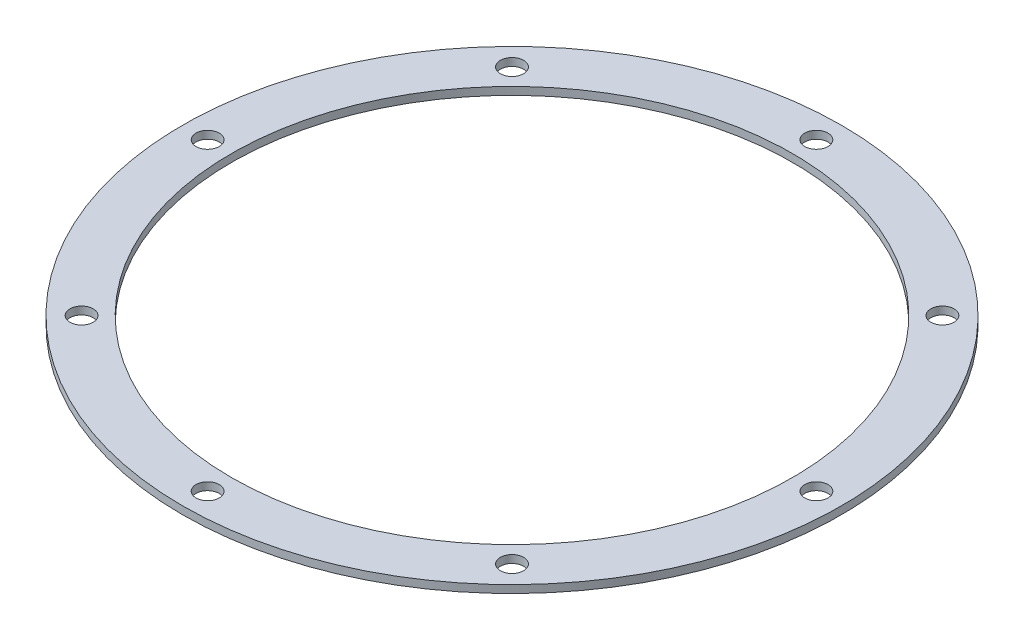
ISO-10303-21;
HEADER;
FILE_DESCRIPTION(('STEP AP214'),'2;1');
FILE_NAME('part.step','',(''),(''),'','','');
FILE_SCHEMA(('AUTOMOTIVE_DESIGN { 1 0 10303 214 1 1 1 1 }'));
ENDSEC;
DATA;
#1=APPLICATION_CONTEXT('core data for automotive mechanical design processes');
#2=APPLICATION_PROTOCOL_DEFINITION('international standard','automotive_design',2000,#1);
#3=PRODUCT_CONTEXT('',#1,'mechanical');
#4=PRODUCT('Part','Part','',(#3));
#5=PRODUCT_RELATED_PRODUCT_CATEGORY('part','',(#4));
#6=PRODUCT_DEFINITION_FORMATION('','',#4);
#7=PRODUCT_DEFINITION_CONTEXT('part definition',#1,'design');
#8=PRODUCT_DEFINITION('design','',#6,#7);
#9=PRODUCT_DEFINITION_SHAPE('','',#8);
#10=(LENGTH_UNIT() NAMED_UNIT(*) SI_UNIT(.MILLI.,.METRE.));
#11=(NAMED_UNIT(*) PLANE_ANGLE_UNIT() SI_UNIT($,.RADIAN.));
#12=(NAMED_UNIT(*) SI_UNIT($,.STERADIAN.) SOLID_ANGLE_UNIT());
#13=UNCERTAINTY_MEASURE_WITH_UNIT(LENGTH_MEASURE(1.E-05),#10,'distance_accuracy_value','');
#14=(GEOMETRIC_REPRESENTATION_CONTEXT(3) GLOBAL_UNCERTAINTY_ASSIGNED_CONTEXT((#13)) GLOBAL_UNIT_ASSIGNED_CONTEXT((#10,
#11,#12)) REPRESENTATION_CONTEXT('',''));
#15=CARTESIAN_POINT('',(0.,0.,0.));
#16=DIRECTION('',(0.,0.,1.));
#17=DIRECTION('',(1.,0.,0.));
#18=AXIS2_PLACEMENT_3D('',#15,#16,#17);
#19=CARTESIAN_POINT('',(0.,2.,0.));
#20=DIRECTION('',(0.,-1.,0.));
#21=DIRECTION('',(0.,0.,-1.));
#22=AXIS2_PLACEMENT_3D('',#19,#20,#21);
#23=CYLINDRICAL_SURFACE('',#22,85.);
#24=CARTESIAN_POINT('',(0.,2.,0.));
#25=DIRECTION('',(0.,1.,0.));
#26=DIRECTION('',(0.,0.,1.));
#27=AXIS2_PLACEMENT_3D('',#24,#25,#26);
#28=CIRCLE('',#27,85.);
#29=CARTESIAN_POINT('',(0.,2.,85.));
#30=VERTEX_POINT('',#29);
#31=EDGE_CURVE('E44',#30,#30,#28,.T.);
#32=ORIENTED_EDGE('',*,*,#31,.F.);
#33=EDGE_LOOP('',(#32));
#34=FACE_BOUND('',#33,.T.);
#35=CARTESIAN_POINT('',(0.,0.,0.));
#36=DIRECTION('',(0.,1.,0.));
#37=DIRECTION('',(0.,0.,1.));
#38=AXIS2_PLACEMENT_3D('',#35,#36,#37);
#39=CIRCLE('',#38,85.);
#40=CARTESIAN_POINT('',(0.,0.,85.));
#41=VERTEX_POINT('',#40);
#42=EDGE_CURVE('E51',#41,#41,#39,.T.);
#43=ORIENTED_EDGE('',*,*,#42,.T.);
#44=EDGE_LOOP('',(#43));
#45=FACE_BOUND('',#44,.T.);
#46=ADVANCED_FACE('F37',(#34,#45),#23,.T.);
#47=CARTESIAN_POINT('',(0.,2.,0.));
#48=DIRECTION('',(0.,-1.,0.));
#49=DIRECTION('',(0.,0.,-1.));
#50=AXIS2_PLACEMENT_3D('',#47,#48,#49);
#51=CYLINDRICAL_SURFACE('',#50,72.375);
#52=CARTESIAN_POINT('',(0.,2.,0.));
#53=DIRECTION('',(0.,1.,0.));
#54=DIRECTION('',(0.,0.,1.));
#55=AXIS2_PLACEMENT_3D('',#52,#53,#54);
#56=CIRCLE('',#55,72.375);
#57=CARTESIAN_POINT('',(0.,2.,72.375));
#58=VERTEX_POINT('',#57);
#59=EDGE_CURVE('E10',#58,#58,#56,.T.);
#60=ORIENTED_EDGE('',*,*,#59,.T.);
#61=EDGE_LOOP('',(#60));
#62=FACE_BOUND('',#61,.T.);
#63=CARTESIAN_POINT('',(0.,0.,0.));
#64=DIRECTION('',(0.,1.,0.));
#65=DIRECTION('',(0.,0.,1.));
#66=AXIS2_PLACEMENT_3D('',#63,#64,#65);
#67=CIRCLE('',#66,72.375);
#68=CARTESIAN_POINT('',(0.,0.,72.375));
#69=VERTEX_POINT('',#68);
#70=EDGE_CURVE('E40',#69,#69,#67,.T.);
#71=ORIENTED_EDGE('',*,*,#70,.F.);
#72=EDGE_LOOP('',(#71));
#73=FACE_BOUND('',#72,.T.);
#74=ADVANCED_FACE('F132',(#62,#73),#51,.F.);
#75=CARTESIAN_POINT('',(0.,2.,0.));
#76=DIRECTION('',(0.,1.,0.));
#77=DIRECTION('',(0.,0.,1.));
#78=AXIS2_PLACEMENT_3D('',#75,#76,#77);
#79=PLANE('',#78);
#80=CARTESIAN_POINT('',(0.,2.,-78.5));
#81=DIRECTION('',(0.,-1.,0.));
#82=DIRECTION('',(0.,0.,-1.));
#83=AXIS2_PLACEMENT_3D('',#80,#81,#82);
#84=CIRCLE('',#83,3.);
#85=CARTESIAN_POINT('',(0.,2.,-81.5));
#86=VERTEX_POINT('',#85);
#87=EDGE_CURVE('E100',#86,#86,#84,.T.);
#88=ORIENTED_EDGE('',*,*,#87,.T.);
#89=EDGE_LOOP('',(#88));
#90=FACE_BOUND('',#89,.T.);
#91=CARTESIAN_POINT('',(-55.5078823231459,2.,-55.5078823231487));
#92=DIRECTION('',(0.,-1.,0.));
#93=DIRECTION('',(0.,0.,-1.));
#94=AXIS2_PLACEMENT_3D('',#91,#92,#93);
#95=CIRCLE('',#94,3.);
#96=CARTESIAN_POINT('',(-55.5078823231459,2.,-58.5078823231487));
#97=VERTEX_POINT('',#96);
#98=EDGE_CURVE('E94',#97,#97,#95,.T.);
#99=ORIENTED_EDGE('',*,*,#98,.T.);
#100=EDGE_LOOP('',(#99));
#101=FACE_BOUND('',#100,.T.);
#102=CARTESIAN_POINT('',(-78.5000000000067,2.,-6.67889235480018E-12));
#103=DIRECTION('',(0.,-1.,0.));
#104=DIRECTION('',(0.,0.,-1.));
#105=AXIS2_PLACEMENT_3D('',#102,#103,#104);
#106=CIRCLE('',#105,3.);
#107=CARTESIAN_POINT('',(-78.5000000000067,2.,-3.00000000000668));
#108=VERTEX_POINT('',#107);
#109=EDGE_CURVE('E88',#108,#108,#106,.T.);
#110=ORIENTED_EDGE('',*,*,#109,.T.);
#111=EDGE_LOOP('',(#110));
#112=FACE_BOUND('',#111,.T.);
#113=CARTESIAN_POINT('',(-55.5078823231554,2.,55.5078823231393));
#114=DIRECTION('',(0.,-1.,0.));
#115=DIRECTION('',(0.,0.,-1.));
#116=AXIS2_PLACEMENT_3D('',#113,#114,#115);
#117=CIRCLE('',#116,3.);
#118=CARTESIAN_POINT('',(-55.5078823231554,2.,52.5078823231393));
#119=VERTEX_POINT('',#118);
#120=EDGE_CURVE('E82',#119,#119,#117,.T.);
#121=ORIENTED_EDGE('',*,*,#120,.T.);
#122=EDGE_LOOP('',(#121));
#123=FACE_BOUND('',#122,.T.);
#124=CARTESIAN_POINT('',(-1.33577847096004E-11,2.,78.5));
#125=DIRECTION('',(0.,-1.,0.));
#126=DIRECTION('',(0.,0.,-1.));
#127=AXIS2_PLACEMENT_3D('',#124,#125,#126);
#128=CIRCLE('',#127,3.);
#129=CARTESIAN_POINT('',(-1.33577847096004E-11,2.,75.5));
#130=VERTEX_POINT('',#129);
#131=EDGE_CURVE('E76',#130,#130,#128,.T.);
#132=ORIENTED_EDGE('',*,*,#131,.T.);
#133=EDGE_LOOP('',(#132));
#134=FACE_BOUND('',#133,.T.);
#135=CARTESIAN_POINT('',(55.5078823231326,2.,55.5078823231487));
#136=DIRECTION('',(0.,-1.,0.));
#137=DIRECTION('',(0.,0.,-1.));
#138=AXIS2_PLACEMENT_3D('',#135,#136,#137);
#139=CIRCLE('',#138,3.);
#140=CARTESIAN_POINT('',(55.5078823231326,2.,52.5078823231487));
#141=VERTEX_POINT('',#140);
#142=EDGE_CURVE('E70',#141,#141,#139,.T.);
#143=ORIENTED_EDGE('',*,*,#142,.T.);
#144=EDGE_LOOP('',(#143));
#145=FACE_BOUND('',#144,.T.);
#146=CARTESIAN_POINT('',(78.4999999999933,2.,6.68850583217349E-12));
#147=DIRECTION('',(0.,-1.,0.));
#148=DIRECTION('',(0.,0.,-1.));
#149=AXIS2_PLACEMENT_3D('',#146,#147,#148);
#150=CIRCLE('',#149,3.);
#151=CARTESIAN_POINT('',(78.4999999999933,2.,-2.99999999999331));
#152=VERTEX_POINT('',#151);
#153=EDGE_CURVE('E62',#152,#152,#150,.T.);
#154=ORIENTED_EDGE('',*,*,#153,.T.);
#155=EDGE_LOOP('',(#154));
#156=FACE_BOUND('',#155,.T.);
#157=CARTESIAN_POINT('',(55.507882323142,2.,-55.5078823231393));
#158=DIRECTION('',(0.,-1.,0.));
#159=DIRECTION('',(0.,0.,-1.));
#160=AXIS2_PLACEMENT_3D('',#157,#158,#159);
#161=CIRCLE('',#160,3.);
#162=CARTESIAN_POINT('',(55.507882323142,2.,-58.5078823231393));
#163=VERTEX_POINT('',#162);
#164=EDGE_CURVE('E53',#163,#163,#161,.T.);
#165=ORIENTED_EDGE('',*,*,#164,.T.);
#166=EDGE_LOOP('',(#165));
#167=FACE_BOUND('',#166,.T.);
#168=ORIENTED_EDGE('',*,*,#31,.T.);
#169=EDGE_LOOP('',(#168));
#170=FACE_BOUND('',#169,.T.);
#171=ORIENTED_EDGE('',*,*,#59,.F.);
#172=EDGE_LOOP('',(#171));
#173=FACE_BOUND('',#172,.T.);
#174=ADVANCED_FACE('F113',(#90,#101,#112,#123,#134,#145,#156,#167,#170,#173),#79,.T.);
#175=CARTESIAN_POINT('',(0.,0.,0.));
#176=DIRECTION('',(0.,1.,0.));
#177=DIRECTION('',(0.,0.,1.));
#178=AXIS2_PLACEMENT_3D('',#175,#176,#177);
#179=PLANE('',#178);
#180=CARTESIAN_POINT('',(0.,0.,-78.5));
#181=DIRECTION('',(0.,-1.,0.));
#182=DIRECTION('',(0.,0.,-1.));
#183=AXIS2_PLACEMENT_3D('',#180,#181,#182);
#184=CIRCLE('',#183,2.99999999999999);
#185=CARTESIAN_POINT('',(0.,0.,-81.5));
#186=VERTEX_POINT('',#185);
#187=EDGE_CURVE('E103',#186,#186,#184,.T.);
#188=ORIENTED_EDGE('',*,*,#187,.F.);
#189=EDGE_LOOP('',(#188));
#190=FACE_BOUND('',#189,.T.);
#191=CARTESIAN_POINT('',(-55.5078823231459,0.,-55.5078823231487));
#192=DIRECTION('',(0.,-1.,0.));
#193=DIRECTION('',(0.,0.,-1.));
#194=AXIS2_PLACEMENT_3D('',#191,#192,#193);
#195=CIRCLE('',#194,2.99999999999999);
#196=CARTESIAN_POINT('',(-55.5078823231459,0.,-58.5078823231487));
#197=VERTEX_POINT('',#196);
#198=EDGE_CURVE('E97',#197,#197,#195,.T.);
#199=ORIENTED_EDGE('',*,*,#198,.F.);
#200=EDGE_LOOP('',(#199));
#201=FACE_BOUND('',#200,.T.);
#202=CARTESIAN_POINT('',(-78.5000000000067,0.,-6.67889235480018E-12));
#203=DIRECTION('',(0.,-1.,0.));
#204=DIRECTION('',(0.,0.,-1.));
#205=AXIS2_PLACEMENT_3D('',#202,#203,#204);
#206=CIRCLE('',#205,2.99999999999999);
#207=CARTESIAN_POINT('',(-78.5000000000067,0.,-3.00000000000667));
#208=VERTEX_POINT('',#207);
#209=EDGE_CURVE('E91',#208,#208,#206,.T.);
#210=ORIENTED_EDGE('',*,*,#209,.F.);
#211=EDGE_LOOP('',(#210));
#212=FACE_BOUND('',#211,.T.);
#213=CARTESIAN_POINT('',(-55.5078823231554,0.,55.5078823231393));
#214=DIRECTION('',(0.,-1.,0.));
#215=DIRECTION('',(0.,0.,-1.));
#216=AXIS2_PLACEMENT_3D('',#213,#214,#215);
#217=CIRCLE('',#216,2.99999999999999);
#218=CARTESIAN_POINT('',(-55.5078823231554,0.,52.5078823231393));
#219=VERTEX_POINT('',#218);
#220=EDGE_CURVE('E85',#219,#219,#217,.T.);
#221=ORIENTED_EDGE('',*,*,#220,.F.);
#222=EDGE_LOOP('',(#221));
#223=FACE_BOUND('',#222,.T.);
#224=CARTESIAN_POINT('',(-1.33577847096004E-11,0.,78.5));
#225=DIRECTION('',(0.,-1.,0.));
#226=DIRECTION('',(0.,0.,-1.));
#227=AXIS2_PLACEMENT_3D('',#224,#225,#226);
#228=CIRCLE('',#227,2.99999999999999);
#229=CARTESIAN_POINT('',(-1.33577847096004E-11,0.,75.5));
#230=VERTEX_POINT('',#229);
#231=EDGE_CURVE('E79',#230,#230,#228,.T.);
#232=ORIENTED_EDGE('',*,*,#231,.F.);
#233=EDGE_LOOP('',(#232));
#234=FACE_BOUND('',#233,.T.);
#235=CARTESIAN_POINT('',(55.5078823231326,0.,55.5078823231487));
#236=DIRECTION('',(0.,-1.,0.));
#237=DIRECTION('',(0.,0.,-1.));
#238=AXIS2_PLACEMENT_3D('',#235,#236,#237);
#239=CIRCLE('',#238,2.99999999999999);
#240=CARTESIAN_POINT('',(55.5078823231326,0.,52.5078823231487));
#241=VERTEX_POINT('',#240);
#242=EDGE_CURVE('E73',#241,#241,#239,.T.);
#243=ORIENTED_EDGE('',*,*,#242,.F.);
#244=EDGE_LOOP('',(#243));
#245=FACE_BOUND('',#244,.T.);
#246=CARTESIAN_POINT('',(78.4999999999933,0.,6.68850583217349E-12));
#247=DIRECTION('',(0.,-1.,0.));
#248=DIRECTION('',(0.,0.,-1.));
#249=AXIS2_PLACEMENT_3D('',#246,#247,#248);
#250=CIRCLE('',#249,2.99999999999999);
#251=CARTESIAN_POINT('',(78.4999999999933,0.,-2.9999999999933));
#252=VERTEX_POINT('',#251);
#253=EDGE_CURVE('E67',#252,#252,#250,.T.);
#254=ORIENTED_EDGE('',*,*,#253,.F.);
#255=EDGE_LOOP('',(#254));
#256=FACE_BOUND('',#255,.T.);
#257=CARTESIAN_POINT('',(55.507882323142,0.,-55.5078823231393));
#258=DIRECTION('',(0.,-1.,0.));
#259=DIRECTION('',(0.,0.,-1.));
#260=AXIS2_PLACEMENT_3D('',#257,#258,#259);
#261=CIRCLE('',#260,2.99999999999999);
#262=CARTESIAN_POINT('',(55.507882323142,0.,-58.5078823231393));
#263=VERTEX_POINT('',#262);
#264=EDGE_CURVE('E58',#263,#263,#261,.T.);
#265=ORIENTED_EDGE('',*,*,#264,.F.);
#266=EDGE_LOOP('',(#265));
#267=FACE_BOUND('',#266,.T.);
#268=ORIENTED_EDGE('',*,*,#42,.F.);
#269=EDGE_LOOP('',(#268));
#270=FACE_BOUND('',#269,.T.);
#271=ORIENTED_EDGE('',*,*,#70,.T.);
#272=EDGE_LOOP('',(#271));
#273=FACE_BOUND('',#272,.T.);
#274=ADVANCED_FACE('F109',(#190,#201,#212,#223,#234,#245,#256,#267,#270,#273),#179,.F.);
#275=CARTESIAN_POINT('',(55.507882323142,0.,-55.5078823231393));
#276=DIRECTION('',(0.,-1.,0.));
#277=DIRECTION('',(0.,0.,-1.));
#278=AXIS2_PLACEMENT_3D('',#275,#276,#277);
#279=CYLINDRICAL_SURFACE('',#278,3.);
#280=ORIENTED_EDGE('',*,*,#164,.F.);
#281=EDGE_LOOP('',(#280));
#282=FACE_BOUND('',#281,.T.);
#283=ORIENTED_EDGE('',*,*,#264,.T.);
#284=EDGE_LOOP('',(#283));
#285=FACE_BOUND('',#284,.T.);
#286=ADVANCED_FACE('F112',(#282,#285),#279,.F.);
#287=CARTESIAN_POINT('',(78.4999999999933,0.,6.68850583217349E-12));
#288=DIRECTION('',(0.,-1.,0.));
#289=DIRECTION('',(0.,0.,-1.));
#290=AXIS2_PLACEMENT_3D('',#287,#288,#289);
#291=CYLINDRICAL_SURFACE('',#290,3.);
#292=ORIENTED_EDGE('',*,*,#153,.F.);
#293=EDGE_LOOP('',(#292));
#294=FACE_BOUND('',#293,.T.);
#295=ORIENTED_EDGE('',*,*,#253,.T.);
#296=EDGE_LOOP('',(#295));
#297=FACE_BOUND('',#296,.T.);
#298=ADVANCED_FACE('F144',(#294,#297),#291,.F.);
#299=CARTESIAN_POINT('',(55.5078823231326,0.,55.5078823231487));
#300=DIRECTION('',(0.,-1.,0.));
#301=DIRECTION('',(0.,0.,-1.));
#302=AXIS2_PLACEMENT_3D('',#299,#300,#301);
#303=CYLINDRICAL_SURFACE('',#302,3.);
#304=ORIENTED_EDGE('',*,*,#142,.F.);
#305=EDGE_LOOP('',(#304));
#306=FACE_BOUND('',#305,.T.);
#307=ORIENTED_EDGE('',*,*,#242,.T.);
#308=EDGE_LOOP('',(#307));
#309=FACE_BOUND('',#308,.T.);
#310=ADVANCED_FACE('F148',(#306,#309),#303,.F.);
#311=CARTESIAN_POINT('',(-1.33577847096004E-11,0.,78.5));
#312=DIRECTION('',(0.,-1.,0.));
#313=DIRECTION('',(0.,0.,-1.));
#314=AXIS2_PLACEMENT_3D('',#311,#312,#313);
#315=CYLINDRICAL_SURFACE('',#314,2.99999999999999);
#316=ORIENTED_EDGE('',*,*,#131,.F.);
#317=EDGE_LOOP('',(#316));
#318=FACE_BOUND('',#317,.T.);
#319=ORIENTED_EDGE('',*,*,#231,.T.);
#320=EDGE_LOOP('',(#319));
#321=FACE_BOUND('',#320,.T.);
#322=ADVANCED_FACE('F152',(#318,#321),#315,.F.);
#323=CARTESIAN_POINT('',(-55.5078823231554,0.,55.5078823231393));
#324=DIRECTION('',(0.,-1.,0.));
#325=DIRECTION('',(0.,0.,-1.));
#326=AXIS2_PLACEMENT_3D('',#323,#324,#325);
#327=CYLINDRICAL_SURFACE('',#326,3.);
#328=ORIENTED_EDGE('',*,*,#120,.F.);
#329=EDGE_LOOP('',(#328));
#330=FACE_BOUND('',#329,.T.);
#331=ORIENTED_EDGE('',*,*,#220,.T.);
#332=EDGE_LOOP('',(#331));
#333=FACE_BOUND('',#332,.T.);
#334=ADVANCED_FACE('F156',(#330,#333),#327,.F.);
#335=CARTESIAN_POINT('',(-78.5000000000067,0.,-6.67889235480018E-12));
#336=DIRECTION('',(0.,-1.,0.));
#337=DIRECTION('',(0.,0.,-1.));
#338=AXIS2_PLACEMENT_3D('',#335,#336,#337);
#339=CYLINDRICAL_SURFACE('',#338,3.);
#340=ORIENTED_EDGE('',*,*,#109,.F.);
#341=EDGE_LOOP('',(#340));
#342=FACE_BOUND('',#341,.T.);
#343=ORIENTED_EDGE('',*,*,#209,.T.);
#344=EDGE_LOOP('',(#343));
#345=FACE_BOUND('',#344,.T.);
#346=ADVANCED_FACE('F160',(#342,#345),#339,.F.);
#347=CARTESIAN_POINT('',(-55.5078823231459,0.,-55.5078823231487));
#348=DIRECTION('',(0.,-1.,0.));
#349=DIRECTION('',(0.,0.,-1.));
#350=AXIS2_PLACEMENT_3D('',#347,#348,#349);
#351=CYLINDRICAL_SURFACE('',#350,3.);
#352=ORIENTED_EDGE('',*,*,#98,.F.);
#353=EDGE_LOOP('',(#352));
#354=FACE_BOUND('',#353,.T.);
#355=ORIENTED_EDGE('',*,*,#198,.T.);
#356=EDGE_LOOP('',(#355));
#357=FACE_BOUND('',#356,.T.);
#358=ADVANCED_FACE('F164',(#354,#357),#351,.F.);
#359=CARTESIAN_POINT('',(0.,0.,-78.5));
#360=DIRECTION('',(0.,-1.,0.));
#361=DIRECTION('',(0.,0.,-1.));
#362=AXIS2_PLACEMENT_3D('',#359,#360,#361);
#363=CYLINDRICAL_SURFACE('',#362,2.99999999999999);
#364=ORIENTED_EDGE('',*,*,#87,.F.);
#365=EDGE_LOOP('',(#364));
#366=FACE_BOUND('',#365,.T.);
#367=ORIENTED_EDGE('',*,*,#187,.T.);
#368=EDGE_LOOP('',(#367));
#369=FACE_BOUND('',#368,.T.);
#370=ADVANCED_FACE('F107',(#366,#369),#363,.F.);
#371=CLOSED_SHELL('',(#46,#74,#174,#274,#286,#298,#310,#322,#334,#346,#358,#370));
#372=MANIFOLD_SOLID_BREP('B2',#371);
#373=ADVANCED_BREP_SHAPE_REPRESENTATION('',(#18,#372),#14);
#374=SHAPE_DEFINITION_REPRESENTATION(#9,#373);
ENDSEC;
END-ISO-10303-21;
